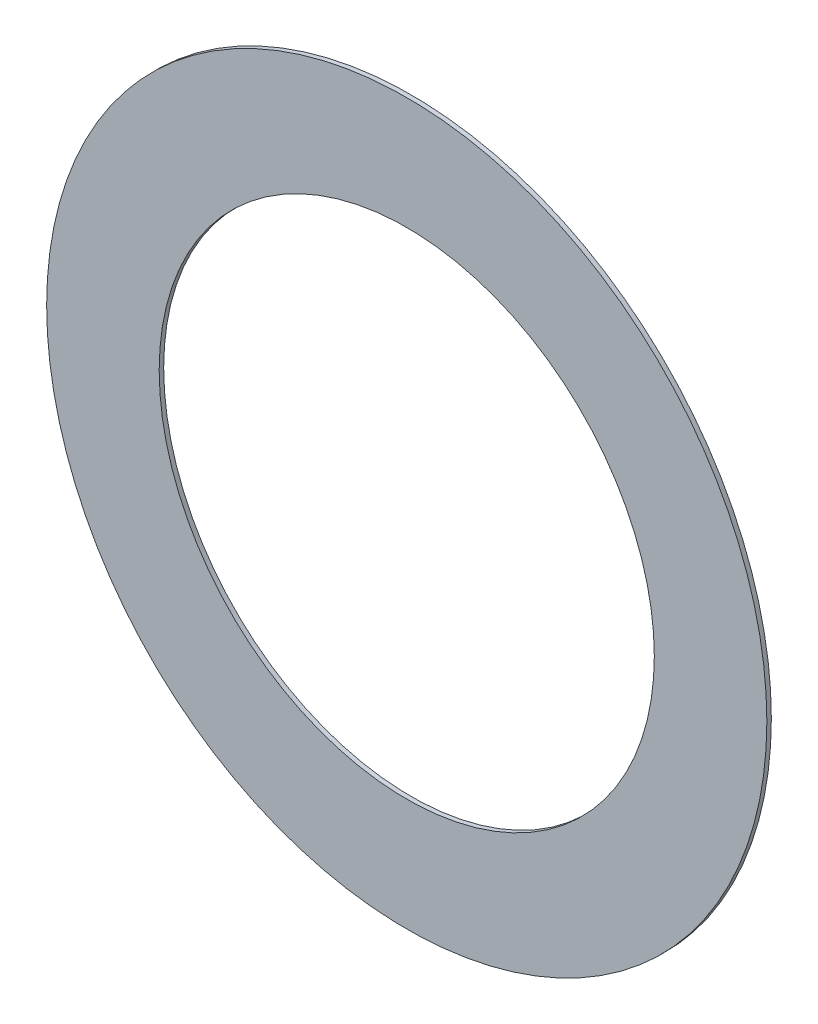
ISO-10303-21;
HEADER;
FILE_DESCRIPTION(('STEP AP214'),'2;1');
FILE_NAME('part.step','',(''),(''),'','','');
FILE_SCHEMA(('AUTOMOTIVE_DESIGN { 1 0 10303 214 1 1 1 1 }'));
ENDSEC;
DATA;
#1=APPLICATION_CONTEXT('core data for automotive mechanical design processes');
#2=APPLICATION_PROTOCOL_DEFINITION('international standard','automotive_design',2000,#1);
#3=PRODUCT_CONTEXT('',#1,'mechanical');
#4=PRODUCT('Part','Part','',(#3));
#5=PRODUCT_RELATED_PRODUCT_CATEGORY('part','',(#4));
#6=PRODUCT_DEFINITION_FORMATION('','',#4);
#7=PRODUCT_DEFINITION_CONTEXT('part definition',#1,'design');
#8=PRODUCT_DEFINITION('design','',#6,#7);
#9=PRODUCT_DEFINITION_SHAPE('','',#8);
#10=(LENGTH_UNIT() NAMED_UNIT(*) SI_UNIT(.MILLI.,.METRE.));
#11=(NAMED_UNIT(*) PLANE_ANGLE_UNIT() SI_UNIT($,.RADIAN.));
#12=(NAMED_UNIT(*) SI_UNIT($,.STERADIAN.) SOLID_ANGLE_UNIT());
#13=UNCERTAINTY_MEASURE_WITH_UNIT(LENGTH_MEASURE(1.E-05),#10,'distance_accuracy_value','');
#14=(GEOMETRIC_REPRESENTATION_CONTEXT(3) GLOBAL_UNCERTAINTY_ASSIGNED_CONTEXT((#13)) GLOBAL_UNIT_ASSIGNED_CONTEXT((#10,
#11,#12)) REPRESENTATION_CONTEXT('',''));
#15=CARTESIAN_POINT('',(0.,0.,0.));
#16=DIRECTION('',(0.,0.,1.));
#17=DIRECTION('',(1.,0.,0.));
#18=AXIS2_PLACEMENT_3D('',#15,#16,#17);
#19=CARTESIAN_POINT('',(0.,0.,0.01));
#20=DIRECTION('',(0.,0.,1.));
#21=DIRECTION('',(1.,0.,0.));
#22=AXIS2_PLACEMENT_3D('',#19,#20,#21);
#23=PLANE('',#22);
#24=CARTESIAN_POINT('',(-6.64,3.985,0.01));
#25=DIRECTION('',(0.,0.,1.));
#26=DIRECTION('',(1.,0.,0.));
#27=AXIS2_PLACEMENT_3D('',#24,#25,#26);
#28=CIRCLE('',#27,0.55);
#29=CARTESIAN_POINT('',(-6.09,3.985,0.01));
#30=VERTEX_POINT('',#29);
#31=EDGE_CURVE('E27',#30,#30,#28,.F.);
#32=ORIENTED_EDGE('',*,*,#31,.T.);
#33=EDGE_LOOP('',(#32));
#34=FACE_BOUND('',#33,.T.);
#35=CARTESIAN_POINT('',(-6.64,3.985,0.01));
#36=DIRECTION('',(0.,0.,1.));
#37=DIRECTION('',(1.,0.,0.));
#38=AXIS2_PLACEMENT_3D('',#35,#36,#37);
#39=CIRCLE('',#38,0.8);
#40=CARTESIAN_POINT('',(-5.84,3.985,0.01));
#41=VERTEX_POINT('',#40);
#42=EDGE_CURVE('E18',#41,#41,#39,.F.);
#43=ORIENTED_EDGE('',*,*,#42,.F.);
#44=EDGE_LOOP('',(#43));
#45=FACE_BOUND('',#44,.T.);
#46=ADVANCED_FACE('F15',(#34,#45),#23,.T.);
#47=CARTESIAN_POINT('',(-6.64,3.985,0.));
#48=DIRECTION('',(0.,0.,1.));
#49=DIRECTION('',(1.,0.,0.));
#50=AXIS2_PLACEMENT_3D('',#47,#48,#49);
#51=CYLINDRICAL_SURFACE('',#50,0.8);
#52=ORIENTED_EDGE('',*,*,#42,.T.);
#53=EDGE_LOOP('',(#52));
#54=FACE_BOUND('',#53,.T.);
#55=CARTESIAN_POINT('',(-6.64,3.985,0.));
#56=DIRECTION('',(0.,0.,1.));
#57=DIRECTION('',(1.,0.,0.));
#58=AXIS2_PLACEMENT_3D('',#55,#56,#57);
#59=CIRCLE('',#58,0.8);
#60=CARTESIAN_POINT('',(-5.84,3.985,0.));
#61=VERTEX_POINT('',#60);
#62=EDGE_CURVE('E22',#61,#61,#59,.T.);
#63=ORIENTED_EDGE('',*,*,#62,.T.);
#64=EDGE_LOOP('',(#63));
#65=FACE_BOUND('',#64,.T.);
#66=ADVANCED_FACE('F35',(#54,#65),#51,.T.);
#67=CARTESIAN_POINT('',(-6.64,3.985,0.));
#68=DIRECTION('',(0.,0.,1.));
#69=DIRECTION('',(1.,0.,0.));
#70=AXIS2_PLACEMENT_3D('',#67,#68,#69);
#71=CYLINDRICAL_SURFACE('',#70,0.55);
#72=ORIENTED_EDGE('',*,*,#31,.F.);
#73=EDGE_LOOP('',(#72));
#74=FACE_BOUND('',#73,.T.);
#75=CARTESIAN_POINT('',(-6.64,3.985,0.));
#76=DIRECTION('',(0.,0.,1.));
#77=DIRECTION('',(1.,0.,0.));
#78=AXIS2_PLACEMENT_3D('',#75,#76,#77);
#79=CIRCLE('',#78,0.55);
#80=CARTESIAN_POINT('',(-6.09,3.985,0.));
#81=VERTEX_POINT('',#80);
#82=EDGE_CURVE('E10',#81,#81,#79,.F.);
#83=ORIENTED_EDGE('',*,*,#82,.T.);
#84=EDGE_LOOP('',(#83));
#85=FACE_BOUND('',#84,.T.);
#86=ADVANCED_FACE('F43',(#74,#85),#71,.F.);
#87=CARTESIAN_POINT('',(0.,0.,0.));
#88=DIRECTION('',(0.,0.,1.));
#89=DIRECTION('',(1.,0.,0.));
#90=AXIS2_PLACEMENT_3D('',#87,#88,#89);
#91=PLANE('',#90);
#92=ORIENTED_EDGE('',*,*,#82,.F.);
#93=EDGE_LOOP('',(#92));
#94=FACE_BOUND('',#93,.T.);
#95=ORIENTED_EDGE('',*,*,#62,.F.);
#96=EDGE_LOOP('',(#95));
#97=FACE_BOUND('',#96,.T.);
#98=ADVANCED_FACE('F44',(#94,#97),#91,.F.);
#99=CLOSED_SHELL('',(#46,#66,#86,#98));
#100=MANIFOLD_SOLID_BREP('B1',#99);
#101=ADVANCED_BREP_SHAPE_REPRESENTATION('',(#18,#100),#14);
#102=SHAPE_DEFINITION_REPRESENTATION(#9,#101);
ENDSEC;
END-ISO-10303-21;
